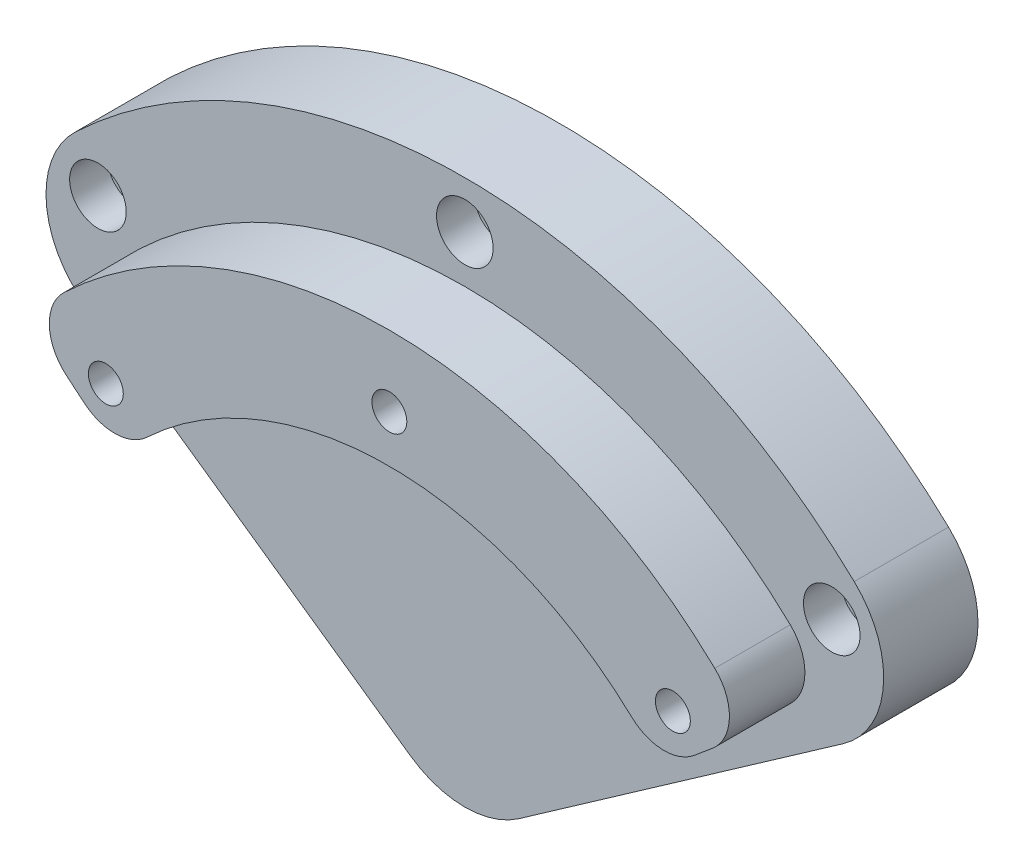
ISO-10303-21;
HEADER;
FILE_DESCRIPTION(('STEP AP214'),'2;1');
FILE_NAME('part.step','',(''),(''),'','','');
FILE_SCHEMA(('AUTOMOTIVE_DESIGN { 1 0 10303 214 1 1 1 1 }'));
ENDSEC;
DATA;
#1=APPLICATION_CONTEXT('core data for automotive mechanical design processes');
#2=APPLICATION_PROTOCOL_DEFINITION('international standard','automotive_design',2000,#1);
#3=PRODUCT_CONTEXT('',#1,'mechanical');
#4=PRODUCT('Part','Part','',(#3));
#5=PRODUCT_RELATED_PRODUCT_CATEGORY('part','',(#4));
#6=PRODUCT_DEFINITION_FORMATION('','',#4);
#7=PRODUCT_DEFINITION_CONTEXT('part definition',#1,'design');
#8=PRODUCT_DEFINITION('design','',#6,#7);
#9=PRODUCT_DEFINITION_SHAPE('','',#8);
#10=(LENGTH_UNIT() NAMED_UNIT(*) SI_UNIT(.MILLI.,.METRE.));
#11=(NAMED_UNIT(*) PLANE_ANGLE_UNIT() SI_UNIT($,.RADIAN.));
#12=(NAMED_UNIT(*) SI_UNIT($,.STERADIAN.) SOLID_ANGLE_UNIT());
#13=UNCERTAINTY_MEASURE_WITH_UNIT(LENGTH_MEASURE(1.E-05),#10,'distance_accuracy_value','');
#14=(GEOMETRIC_REPRESENTATION_CONTEXT(3) GLOBAL_UNCERTAINTY_ASSIGNED_CONTEXT((#13)) GLOBAL_UNIT_ASSIGNED_CONTEXT((#10,
#11,#12)) REPRESENTATION_CONTEXT('',''));
#15=CARTESIAN_POINT('',(0.,0.,0.));
#16=DIRECTION('',(0.,0.,1.));
#17=DIRECTION('',(1.,0.,0.));
#18=AXIS2_PLACEMENT_3D('',#15,#16,#17);
#19=CARTESIAN_POINT('',(38.8908729652601,38.8908729652601,0.));
#20=DIRECTION('',(0.,0.,1.));
#21=DIRECTION('',(1.,0.,0.));
#22=AXIS2_PLACEMENT_3D('',#19,#20,#21);
#23=CYLINDRICAL_SURFACE('',#22,1.60000000000001);
#24=CARTESIAN_POINT('',(38.8908729652601,38.8908729652601,0.));
#25=DIRECTION('',(0.,0.,1.));
#26=DIRECTION('',(1.,0.,0.));
#27=AXIS2_PLACEMENT_3D('',#24,#25,#26);
#28=CIRCLE('',#27,1.60000000000001);
#29=CARTESIAN_POINT('',(40.4908729652601,38.8908729652601,0.));
#30=VERTEX_POINT('',#29);
#31=EDGE_CURVE('E332',#30,#30,#28,.T.);
#32=ORIENTED_EDGE('',*,*,#31,.F.);
#33=EDGE_LOOP('',(#32));
#34=FACE_BOUND('',#33,.T.);
#35=CARTESIAN_POINT('',(38.8908729652601,38.8908729652601,6.));
#36=DIRECTION('',(0.,0.,1.));
#37=DIRECTION('',(1.,0.,0.));
#38=AXIS2_PLACEMENT_3D('',#35,#36,#37);
#39=CIRCLE('',#38,1.60000000000001);
#40=CARTESIAN_POINT('',(40.4908729652601,38.8908729652601,6.));
#41=VERTEX_POINT('',#40);
#42=EDGE_CURVE('E55',#41,#41,#39,.F.);
#43=ORIENTED_EDGE('',*,*,#42,.F.);
#44=EDGE_LOOP('',(#43));
#45=FACE_BOUND('',#44,.T.);
#46=ADVANCED_FACE('F51',(#34,#45),#23,.F.);
#47=CARTESIAN_POINT('',(0.,55.,0.));
#48=DIRECTION('',(0.,0.,1.));
#49=DIRECTION('',(1.,0.,0.));
#50=AXIS2_PLACEMENT_3D('',#47,#48,#49);
#51=CYLINDRICAL_SURFACE('',#50,1.6);
#52=CARTESIAN_POINT('',(0.,55.,0.));
#53=DIRECTION('',(0.,0.,1.));
#54=DIRECTION('',(1.,0.,0.));
#55=AXIS2_PLACEMENT_3D('',#52,#53,#54);
#56=CIRCLE('',#55,1.6);
#57=CARTESIAN_POINT('',(1.6,55.,0.));
#58=VERTEX_POINT('',#57);
#59=EDGE_CURVE('E191',#58,#58,#56,.T.);
#60=ORIENTED_EDGE('',*,*,#59,.F.);
#61=EDGE_LOOP('',(#60));
#62=FACE_BOUND('',#61,.T.);
#63=CARTESIAN_POINT('',(0.,55.,6.));
#64=DIRECTION('',(0.,0.,1.));
#65=DIRECTION('',(1.,0.,0.));
#66=AXIS2_PLACEMENT_3D('',#63,#64,#65);
#67=CIRCLE('',#66,1.6);
#68=CARTESIAN_POINT('',(1.6,55.,6.));
#69=VERTEX_POINT('',#68);
#70=EDGE_CURVE('E276',#69,#69,#67,.F.);
#71=ORIENTED_EDGE('',*,*,#70,.F.);
#72=EDGE_LOOP('',(#71));
#73=FACE_BOUND('',#72,.T.);
#74=ADVANCED_FACE('F387',(#62,#73),#51,.F.);
#75=CARTESIAN_POINT('',(-38.8908729652601,38.8908729652601,0.));
#76=DIRECTION('',(0.,0.,1.));
#77=DIRECTION('',(1.,0.,0.));
#78=AXIS2_PLACEMENT_3D('',#75,#76,#77);
#79=CYLINDRICAL_SURFACE('',#78,1.6);
#80=CARTESIAN_POINT('',(-38.8908729652601,38.8908729652601,0.));
#81=DIRECTION('',(0.,0.,1.));
#82=DIRECTION('',(1.,0.,0.));
#83=AXIS2_PLACEMENT_3D('',#80,#81,#82);
#84=CIRCLE('',#83,1.6);
#85=CARTESIAN_POINT('',(-37.2908729652601,38.8908729652601,0.));
#86=VERTEX_POINT('',#85);
#87=EDGE_CURVE('E184',#86,#86,#84,.T.);
#88=ORIENTED_EDGE('',*,*,#87,.F.);
#89=EDGE_LOOP('',(#88));
#90=FACE_BOUND('',#89,.T.);
#91=CARTESIAN_POINT('',(-38.8908729652601,38.8908729652601,6.));
#92=DIRECTION('',(0.,0.,1.));
#93=DIRECTION('',(1.,0.,0.));
#94=AXIS2_PLACEMENT_3D('',#91,#92,#93);
#95=CIRCLE('',#94,1.6);
#96=CARTESIAN_POINT('',(-37.2908729652601,38.8908729652601,6.));
#97=VERTEX_POINT('',#96);
#98=EDGE_CURVE('E273',#97,#97,#95,.F.);
#99=ORIENTED_EDGE('',*,*,#98,.F.);
#100=EDGE_LOOP('',(#99));
#101=FACE_BOUND('',#100,.T.);
#102=ADVANCED_FACE('F393',(#90,#101),#79,.F.);
#103=CARTESIAN_POINT('',(30.0520382004283,30.0520382004283,18.));
#104=DIRECTION('',(0.,0.,-1.));
#105=DIRECTION('',(-1.,0.,0.));
#106=AXIS2_PLACEMENT_3D('',#103,#104,#105);
#107=CYLINDRICAL_SURFACE('',#106,1.85);
#108=CARTESIAN_POINT('',(30.0520382004283,30.0520382004283,18.));
#109=DIRECTION('',(0.,0.,1.));
#110=DIRECTION('',(1.,0.,0.));
#111=AXIS2_PLACEMENT_3D('',#108,#109,#110);
#112=CIRCLE('',#111,1.85);
#113=CARTESIAN_POINT('',(31.9020382004283,30.0520382004283,18.));
#114=VERTEX_POINT('',#113);
#115=EDGE_CURVE('E324',#114,#114,#112,.T.);
#116=ORIENTED_EDGE('',*,*,#115,.T.);
#117=EDGE_LOOP('',(#116));
#118=FACE_BOUND('',#117,.T.);
#119=CARTESIAN_POINT('',(30.0520382004283,30.0520382004283,5.));
#120=DIRECTION('',(0.,0.,-1.));
#121=DIRECTION('',(-1.,0.,0.));
#122=AXIS2_PLACEMENT_3D('',#119,#120,#121);
#123=CIRCLE('',#122,1.85);
#124=CARTESIAN_POINT('',(28.2020382004283,30.0520382004283,5.));
#125=VERTEX_POINT('',#124);
#126=EDGE_CURVE('E767',#125,#125,#123,.F.);
#127=ORIENTED_EDGE('',*,*,#126,.F.);
#128=EDGE_LOOP('',(#127));
#129=FACE_BOUND('',#128,.T.);
#130=ADVANCED_FACE('F551',(#118,#129),#107,.F.);
#131=CARTESIAN_POINT('',(-30.0520382004283,30.0520382004283,18.));
#132=DIRECTION('',(0.,0.,-1.));
#133=DIRECTION('',(-1.,0.,0.));
#134=AXIS2_PLACEMENT_3D('',#131,#132,#133);
#135=CYLINDRICAL_SURFACE('',#134,1.85);
#136=CARTESIAN_POINT('',(-30.0520382004283,30.0520382004283,18.));
#137=DIRECTION('',(0.,0.,1.));
#138=DIRECTION('',(1.,0.,0.));
#139=AXIS2_PLACEMENT_3D('',#136,#137,#138);
#140=CIRCLE('',#139,1.85);
#141=CARTESIAN_POINT('',(-28.2020382004283,30.0520382004283,18.));
#142=VERTEX_POINT('',#141);
#143=EDGE_CURVE('E303',#142,#142,#140,.T.);
#144=ORIENTED_EDGE('',*,*,#143,.T.);
#145=EDGE_LOOP('',(#144));
#146=FACE_BOUND('',#145,.T.);
#147=CARTESIAN_POINT('',(-30.0520382004283,30.0520382004283,5.));
#148=DIRECTION('',(0.,0.,-1.));
#149=DIRECTION('',(-1.,0.,0.));
#150=AXIS2_PLACEMENT_3D('',#147,#148,#149);
#151=CIRCLE('',#150,1.85);
#152=CARTESIAN_POINT('',(-31.9020382004283,30.0520382004283,5.));
#153=VERTEX_POINT('',#152);
#154=EDGE_CURVE('E295',#153,#153,#151,.T.);
#155=ORIENTED_EDGE('',*,*,#154,.T.);
#156=EDGE_LOOP('',(#155));
#157=FACE_BOUND('',#156,.T.);
#158=ADVANCED_FACE('F556',(#146,#157),#135,.F.);
#159=CARTESIAN_POINT('',(0.,42.5,18.));
#160=DIRECTION('',(0.,0.,-1.));
#161=DIRECTION('',(-1.,0.,0.));
#162=AXIS2_PLACEMENT_3D('',#159,#160,#161);
#163=CYLINDRICAL_SURFACE('',#162,1.85);
#164=CARTESIAN_POINT('',(0.,42.5,18.));
#165=DIRECTION('',(0.,0.,1.));
#166=DIRECTION('',(1.,0.,0.));
#167=AXIS2_PLACEMENT_3D('',#164,#165,#166);
#168=CIRCLE('',#167,1.85);
#169=CARTESIAN_POINT('',(1.85,42.5,18.));
#170=VERTEX_POINT('',#169);
#171=EDGE_CURVE('E328',#170,#170,#168,.T.);
#172=ORIENTED_EDGE('',*,*,#171,.T.);
#173=EDGE_LOOP('',(#172));
#174=FACE_BOUND('',#173,.T.);
#175=CARTESIAN_POINT('',(0.,42.5,5.));
#176=DIRECTION('',(0.,0.,-1.));
#177=DIRECTION('',(-1.,0.,0.));
#178=AXIS2_PLACEMENT_3D('',#175,#176,#177);
#179=CIRCLE('',#178,1.85);
#180=CARTESIAN_POINT('',(-1.85,42.5,5.));
#181=VERTEX_POINT('',#180);
#182=EDGE_CURVE('E782',#181,#181,#179,.F.);
#183=ORIENTED_EDGE('',*,*,#182,.F.);
#184=EDGE_LOOP('',(#183));
#185=FACE_BOUND('',#184,.T.);
#186=ADVANCED_FACE('F405',(#174,#185),#163,.F.);
#187=CARTESIAN_POINT('',(0.,0.,0.));
#188=DIRECTION('',(0.,0.,1.));
#189=DIRECTION('',(1.,0.,0.));
#190=AXIS2_PLACEMENT_3D('',#187,#188,#189);
#191=PLANE('',#190);
#192=CARTESIAN_POINT('',(30.0520382004283,30.0520382004283,0.));
#193=DIRECTION('',(0.,0.,-1.));
#194=DIRECTION('',(-1.,0.,0.));
#195=AXIS2_PLACEMENT_3D('',#192,#193,#194);
#196=CIRCLE('',#195,3.25);
#197=CARTESIAN_POINT('',(26.8020382004283,30.0520382004283,0.));
#198=VERTEX_POINT('',#197);
#199=EDGE_CURVE('E771',#198,#198,#196,.T.);
#200=ORIENTED_EDGE('',*,*,#199,.F.);
#201=EDGE_LOOP('',(#200));
#202=FACE_BOUND('',#201,.T.);
#203=CARTESIAN_POINT('',(0.,42.5,0.));
#204=DIRECTION('',(0.,0.,-1.));
#205=DIRECTION('',(-1.,0.,0.));
#206=AXIS2_PLACEMENT_3D('',#203,#204,#205);
#207=CIRCLE('',#206,3.25);
#208=CARTESIAN_POINT('',(-3.25,42.5,0.));
#209=VERTEX_POINT('',#208);
#210=EDGE_CURVE('E778',#209,#209,#207,.T.);
#211=ORIENTED_EDGE('',*,*,#210,.F.);
#212=EDGE_LOOP('',(#211));
#213=FACE_BOUND('',#212,.T.);
#214=CARTESIAN_POINT('',(-30.0520382004283,30.0520382004283,0.));
#215=DIRECTION('',(0.,0.,-1.));
#216=DIRECTION('',(-1.,0.,0.));
#217=AXIS2_PLACEMENT_3D('',#214,#215,#216);
#218=CIRCLE('',#217,3.25);
#219=CARTESIAN_POINT('',(-33.3020382004283,30.0520382004283,0.));
#220=VERTEX_POINT('',#219);
#221=EDGE_CURVE('E289',#220,#220,#218,.T.);
#222=ORIENTED_EDGE('',*,*,#221,.F.);
#223=EDGE_LOOP('',(#222));
#224=FACE_BOUND('',#223,.T.);
#225=ORIENTED_EDGE('',*,*,#87,.T.);
#226=EDGE_LOOP('',(#225));
#227=FACE_BOUND('',#226,.T.);
#228=ORIENTED_EDGE('',*,*,#59,.T.);
#229=EDGE_LOOP('',(#228));
#230=FACE_BOUND('',#229,.T.);
#231=ORIENTED_EDGE('',*,*,#31,.T.);
#232=EDGE_LOOP('',(#231));
#233=FACE_BOUND('',#232,.T.);
#234=CARTESIAN_POINT('',(0.,0.,0.));
#235=DIRECTION('',(0.,0.,1.));
#236=DIRECTION('',(1.,0.,0.));
#237=AXIS2_PLACEMENT_3D('',#234,#235,#236);
#238=CIRCLE('',#237,60.);
#239=CARTESIAN_POINT('',(41.2731914901654,43.5490948725245,0.));
#240=VERTEX_POINT('',#239);
#241=CARTESIAN_POINT('',(-41.2731914901654,43.5490948725245,0.));
#242=VERTEX_POINT('',#241);
#243=EDGE_CURVE('E172',#240,#242,#238,.T.);
#244=ORIENTED_EDGE('',*,*,#243,.F.);
#245=CARTESIAN_POINT('',(34.3943262418045,36.2909123937704,0.));
#246=DIRECTION('',(0.,0.,1.));
#247=DIRECTION('',(1.,0.,0.));
#248=AXIS2_PLACEMENT_3D('',#245,#246,#247);
#249=CIRCLE('',#248,10.);
#250=CARTESIAN_POINT('',(40.130090605315,28.0993919508805,0.));
#251=VERTEX_POINT('',#250);
#252=EDGE_CURVE('E154',#240,#251,#249,.F.);
#253=ORIENTED_EDGE('',*,*,#252,.T.);
#254=DIRECTION('',(0.819152044288989,0.57357643635105,0.));
#255=VECTOR('',#254,1.);
#256=CARTESIAN_POINT('',(0.,0.,0.));
#257=LINE('',#256,#255);
#258=CARTESIAN_POINT('',(5.7357643635105,4.01622544472471,0.));
#259=VERTEX_POINT('',#258);
#260=EDGE_CURVE('E188',#259,#251,#257,.T.);
#261=ORIENTED_EDGE('',*,*,#260,.F.);
#262=CARTESIAN_POINT('',(0.,12.2077458876146,0.));
#263=DIRECTION('',(0.,0.,1.));
#264=DIRECTION('',(1.,0.,0.));
#265=AXIS2_PLACEMENT_3D('',#262,#263,#264);
#266=CIRCLE('',#265,10.);
#267=CARTESIAN_POINT('',(-5.7357643635105,4.01622544472471,0.));
#268=VERTEX_POINT('',#267);
#269=EDGE_CURVE('E177',#259,#268,#266,.F.);
#270=ORIENTED_EDGE('',*,*,#269,.T.);
#271=DIRECTION('',(-0.819152044288989,0.57357643635105,0.));
#272=VECTOR('',#271,1.);
#273=CARTESIAN_POINT('',(0.,0.,0.));
#274=LINE('',#273,#272);
#275=CARTESIAN_POINT('',(-40.130090605315,28.0993919508805,0.));
#276=VERTEX_POINT('',#275);
#277=EDGE_CURVE('E183',#268,#276,#274,.T.);
#278=ORIENTED_EDGE('',*,*,#277,.T.);
#279=CARTESIAN_POINT('',(-34.3943262418045,36.2909123937704,0.));
#280=DIRECTION('',(0.,0.,1.));
#281=DIRECTION('',(1.,0.,0.));
#282=AXIS2_PLACEMENT_3D('',#279,#280,#281);
#283=CIRCLE('',#282,10.);
#284=EDGE_CURVE('E166',#276,#242,#283,.F.);
#285=ORIENTED_EDGE('',*,*,#284,.T.);
#286=EDGE_LOOP('',(#244,#253,#261,#270,#278,#285));
#287=FACE_BOUND('',#286,.T.);
#288=ADVANCED_FACE('F180',(#202,#213,#224,#227,#230,#233,#287),#191,.F.);
#289=CARTESIAN_POINT('',(0.,0.,10.));
#290=DIRECTION('',(0.,0.,-1.));
#291=DIRECTION('',(-1.,0.,0.));
#292=AXIS2_PLACEMENT_3D('',#289,#290,#291);
#293=CYLINDRICAL_SURFACE('',#292,60.);
#294=CARTESIAN_POINT('',(0.,0.,10.));
#295=DIRECTION('',(0.,0.,1.));
#296=DIRECTION('',(1.,0.,0.));
#297=AXIS2_PLACEMENT_3D('',#294,#295,#296);
#298=CIRCLE('',#297,60.);
#299=CARTESIAN_POINT('',(41.2731914901654,43.5490948725245,10.));
#300=VERTEX_POINT('',#299);
#301=CARTESIAN_POINT('',(-41.2731914901654,43.5490948725245,10.));
#302=VERTEX_POINT('',#301);
#303=EDGE_CURVE('E175',#300,#302,#298,.T.);
#304=ORIENTED_EDGE('',*,*,#303,.F.);
#305=DIRECTION('',(0.,0.,-1.));
#306=VECTOR('',#305,1.);
#307=CARTESIAN_POINT('',(41.2731914901654,43.5490948725245,10.));
#308=LINE('',#307,#306);
#309=EDGE_CURVE('E158',#300,#240,#308,.T.);
#310=ORIENTED_EDGE('',*,*,#309,.T.);
#311=ORIENTED_EDGE('',*,*,#243,.T.);
#312=DIRECTION('',(0.,0.,-1.));
#313=VECTOR('',#312,1.);
#314=CARTESIAN_POINT('',(-41.2731914901654,43.5490948725245,10.));
#315=LINE('',#314,#313);
#316=EDGE_CURVE('E178',#242,#302,#315,.F.);
#317=ORIENTED_EDGE('',*,*,#316,.T.);
#318=EDGE_LOOP('',(#304,#310,#311,#317));
#319=FACE_BOUND('',#318,.T.);
#320=ADVANCED_FACE('F171',(#319),#293,.T.);
#321=CARTESIAN_POINT('',(0.,0.,10.));
#322=DIRECTION('',(-0.57357643635105,-0.819152044288989,0.));
#323=DIRECTION('',(0.819152044288989,-0.57357643635105,0.));
#324=AXIS2_PLACEMENT_3D('',#321,#322,#323);
#325=PLANE('',#324);
#326=DIRECTION('',(-0.819152044288989,0.57357643635105,0.));
#327=VECTOR('',#326,1.);
#328=CARTESIAN_POINT('',(0.,0.,10.));
#329=LINE('',#328,#327);
#330=CARTESIAN_POINT('',(-5.7357643635105,4.01622544472471,10.));
#331=VERTEX_POINT('',#330);
#332=CARTESIAN_POINT('',(-40.130090605315,28.0993919508805,10.));
#333=VERTEX_POINT('',#332);
#334=EDGE_CURVE('E354',#331,#333,#329,.T.);
#335=ORIENTED_EDGE('',*,*,#334,.T.);
#336=DIRECTION('',(0.,0.,1.));
#337=VECTOR('',#336,1.);
#338=CARTESIAN_POINT('',(-40.130090605315,28.0993919508805,0.));
#339=LINE('',#338,#337);
#340=EDGE_CURVE('E222',#333,#276,#339,.F.);
#341=ORIENTED_EDGE('',*,*,#340,.T.);
#342=ORIENTED_EDGE('',*,*,#277,.F.);
#343=DIRECTION('',(0.,0.,-1.));
#344=VECTOR('',#343,1.);
#345=CARTESIAN_POINT('',(-5.7357643635105,4.01622544472471,10.));
#346=LINE('',#345,#344);
#347=EDGE_CURVE('E219',#268,#331,#346,.F.);
#348=ORIENTED_EDGE('',*,*,#347,.T.);
#349=EDGE_LOOP('',(#335,#341,#342,#348));
#350=FACE_BOUND('',#349,.T.);
#351=ADVANCED_FACE('F373',(#350),#325,.T.);
#352=CARTESIAN_POINT('',(0.,0.,10.));
#353=DIRECTION('',(-0.57357643635105,0.819152044288989,0.));
#354=DIRECTION('',(-0.819152044288989,-0.57357643635105,0.));
#355=AXIS2_PLACEMENT_3D('',#352,#353,#354);
#356=PLANE('',#355);
#357=ORIENTED_EDGE('',*,*,#260,.T.);
#358=DIRECTION('',(0.,0.,-1.));
#359=VECTOR('',#358,1.);
#360=CARTESIAN_POINT('',(40.130090605315,28.0993919508805,10.));
#361=LINE('',#360,#359);
#362=CARTESIAN_POINT('',(40.130090605315,28.0993919508805,10.));
#363=VERTEX_POINT('',#362);
#364=EDGE_CURVE('E159',#251,#363,#361,.F.);
#365=ORIENTED_EDGE('',*,*,#364,.T.);
#366=DIRECTION('',(0.819152044288989,0.57357643635105,0.));
#367=VECTOR('',#366,1.);
#368=CARTESIAN_POINT('',(0.,0.,10.));
#369=LINE('',#368,#367);
#370=CARTESIAN_POINT('',(5.7357643635105,4.01622544472471,10.));
#371=VERTEX_POINT('',#370);
#372=EDGE_CURVE('E194',#371,#363,#369,.T.);
#373=ORIENTED_EDGE('',*,*,#372,.F.);
#374=DIRECTION('',(0.,0.,-1.));
#375=VECTOR('',#374,1.);
#376=CARTESIAN_POINT('',(5.7357643635105,4.01622544472471,0.));
#377=LINE('',#376,#375);
#378=EDGE_CURVE('E165',#371,#259,#377,.T.);
#379=ORIENTED_EDGE('',*,*,#378,.T.);
#380=EDGE_LOOP('',(#357,#365,#373,#379));
#381=FACE_BOUND('',#380,.T.);
#382=ADVANCED_FACE('F368',(#381),#356,.F.);
#383=CARTESIAN_POINT('',(0.,0.,10.));
#384=DIRECTION('',(0.,0.,1.));
#385=DIRECTION('',(1.,0.,0.));
#386=AXIS2_PLACEMENT_3D('',#383,#384,#385);
#387=PLANE('',#386);
#388=CARTESIAN_POINT('',(-38.8908729652601,38.8908729652601,10.));
#389=DIRECTION('',(0.,0.,1.));
#390=DIRECTION('',(1.,0.,0.));
#391=AXIS2_PLACEMENT_3D('',#388,#389,#390);
#392=CIRCLE('',#391,3.);
#393=CARTESIAN_POINT('',(-35.8908729652601,38.8908729652601,10.));
#394=VERTEX_POINT('',#393);
#395=EDGE_CURVE('E815',#394,#394,#392,.T.);
#396=ORIENTED_EDGE('',*,*,#395,.F.);
#397=EDGE_LOOP('',(#396));
#398=FACE_BOUND('',#397,.T.);
#399=CARTESIAN_POINT('',(0.,55.,10.));
#400=DIRECTION('',(0.,0.,1.));
#401=DIRECTION('',(1.,0.,0.));
#402=AXIS2_PLACEMENT_3D('',#399,#400,#401);
#403=CIRCLE('',#402,3.);
#404=CARTESIAN_POINT('',(3.,55.,10.));
#405=VERTEX_POINT('',#404);
#406=EDGE_CURVE('E762',#405,#405,#403,.T.);
#407=ORIENTED_EDGE('',*,*,#406,.F.);
#408=EDGE_LOOP('',(#407));
#409=FACE_BOUND('',#408,.T.);
#410=CARTESIAN_POINT('',(38.8908729652601,38.8908729652601,10.));
#411=DIRECTION('',(0.,0.,1.));
#412=DIRECTION('',(1.,0.,0.));
#413=AXIS2_PLACEMENT_3D('',#410,#411,#412);
#414=CIRCLE('',#413,3.);
#415=CARTESIAN_POINT('',(41.8908729652601,38.8908729652601,10.));
#416=VERTEX_POINT('',#415);
#417=EDGE_CURVE('E754',#416,#416,#414,.T.);
#418=ORIENTED_EDGE('',*,*,#417,.F.);
#419=EDGE_LOOP('',(#418));
#420=FACE_BOUND('',#419,.T.);
#421=CARTESIAN_POINT('',(0.,0.,10.));
#422=DIRECTION('',(0.,0.,1.));
#423=DIRECTION('',(1.,0.,0.));
#424=AXIS2_PLACEMENT_3D('',#421,#422,#423);
#425=CIRCLE('',#424,37.5);
#426=CARTESIAN_POINT('',(25.691345773208,27.3167485686248,10.));
#427=VERTEX_POINT('',#426);
#428=CARTESIAN_POINT('',(-25.691345773208,27.3167485686248,10.));
#429=VERTEX_POINT('',#428);
#430=EDGE_CURVE('E341',#427,#429,#425,.T.);
#431=ORIENTED_EDGE('',*,*,#430,.T.);
#432=CARTESIAN_POINT('',(-29.1168585429691,30.9589817111081,10.));
#433=DIRECTION('',(0.,0.,1.));
#434=DIRECTION('',(1.,0.,0.));
#435=AXIS2_PLACEMENT_3D('',#432,#433,#434);
#436=CIRCLE('',#435,5.);
#437=CARTESIAN_POINT('',(-32.3307965914018,27.1287594955132,10.));
#438=VERTEX_POINT('',#437);
#439=EDGE_CURVE('E12',#429,#438,#436,.F.);
#440=ORIENTED_EDGE('',*,*,#439,.T.);
#441=DIRECTION('',(-0.766044443118975,0.642787609686543,0.));
#442=VECTOR('',#441,1.);
#443=CARTESIAN_POINT('',(0.,0.,10.));
#444=LINE('',#443,#442);
#445=CARTESIAN_POINT('',(-34.258548972,28.7463358070743,10.));
#446=VERTEX_POINT('',#445);
#447=EDGE_CURVE('E337',#438,#446,#444,.T.);
#448=ORIENTED_EDGE('',*,*,#447,.T.);
#449=CARTESIAN_POINT('',(-31.0446109235673,32.5765580226691,10.));
#450=DIRECTION('',(0.,0.,1.));
#451=DIRECTION('',(1.,0.,0.));
#452=AXIS2_PLACEMENT_3D('',#449,#450,#451);
#453=CIRCLE('',#452,5.);
#454=CARTESIAN_POINT('',(-34.4940121372969,36.1961755807435,10.));
#455=VERTEX_POINT('',#454);
#456=EDGE_CURVE('E61',#446,#455,#453,.F.);
#457=ORIENTED_EDGE('',*,*,#456,.T.);
#458=CARTESIAN_POINT('',(0.,0.,10.));
#459=DIRECTION('',(0.,0.,1.));
#460=DIRECTION('',(1.,0.,0.));
#461=AXIS2_PLACEMENT_3D('',#458,#459,#460);
#462=CIRCLE('',#461,50.);
#463=CARTESIAN_POINT('',(34.4940121372969,36.1961755807435,10.));
#464=VERTEX_POINT('',#463);
#465=EDGE_CURVE('E333',#464,#455,#462,.T.);
#466=ORIENTED_EDGE('',*,*,#465,.F.);
#467=CARTESIAN_POINT('',(31.0446109235672,32.5765580226692,10.));
#468=DIRECTION('',(0.,0.,1.));
#469=DIRECTION('',(1.,0.,0.));
#470=AXIS2_PLACEMENT_3D('',#467,#468,#469);
#471=CIRCLE('',#470,5.);
#472=CARTESIAN_POINT('',(34.258548972,28.7463358070743,10.));
#473=VERTEX_POINT('',#472);
#474=EDGE_CURVE('E268',#464,#473,#471,.F.);
#475=ORIENTED_EDGE('',*,*,#474,.T.);
#476=DIRECTION('',(0.766044443118974,0.642787609686544,0.));
#477=VECTOR('',#476,1.);
#478=CARTESIAN_POINT('',(0.,0.,10.));
#479=LINE('',#478,#477);
#480=CARTESIAN_POINT('',(32.3307965914018,27.1287594955132,10.));
#481=VERTEX_POINT('',#480);
#482=EDGE_CURVE('E308',#481,#473,#479,.T.);
#483=ORIENTED_EDGE('',*,*,#482,.F.);
#484=CARTESIAN_POINT('',(29.1168585429691,30.9589817111081,10.));
#485=DIRECTION('',(0.,0.,1.));
#486=DIRECTION('',(1.,0.,0.));
#487=AXIS2_PLACEMENT_3D('',#484,#485,#486);
#488=CIRCLE('',#487,5.);
#489=EDGE_CURVE('E265',#481,#427,#488,.F.);
#490=ORIENTED_EDGE('',*,*,#489,.T.);
#491=EDGE_LOOP('',(#431,#440,#448,#457,#466,#475,#483,#490));
#492=FACE_BOUND('',#491,.T.);
#493=ORIENTED_EDGE('',*,*,#372,.T.);
#494=CARTESIAN_POINT('',(34.3943262418045,36.2909123937704,10.));
#495=DIRECTION('',(0.,0.,1.));
#496=DIRECTION('',(1.,0.,0.));
#497=AXIS2_PLACEMENT_3D('',#494,#495,#496);
#498=CIRCLE('',#497,10.);
#499=EDGE_CURVE('E216',#363,#300,#498,.T.);
#500=ORIENTED_EDGE('',*,*,#499,.T.);
#501=ORIENTED_EDGE('',*,*,#303,.T.);
#502=CARTESIAN_POINT('',(-34.3943262418045,36.2909123937704,10.));
#503=DIRECTION('',(0.,0.,1.));
#504=DIRECTION('',(1.,0.,0.));
#505=AXIS2_PLACEMENT_3D('',#502,#503,#504);
#506=CIRCLE('',#505,10.);
#507=EDGE_CURVE('E213',#302,#333,#506,.T.);
#508=ORIENTED_EDGE('',*,*,#507,.T.);
#509=ORIENTED_EDGE('',*,*,#334,.F.);
#510=CARTESIAN_POINT('',(0.,12.2077458876146,10.));
#511=DIRECTION('',(0.,0.,1.));
#512=DIRECTION('',(1.,0.,0.));
#513=AXIS2_PLACEMENT_3D('',#510,#511,#512);
#514=CIRCLE('',#513,10.);
#515=EDGE_CURVE('E210',#331,#371,#514,.T.);
#516=ORIENTED_EDGE('',*,*,#515,.T.);
#517=EDGE_LOOP('',(#493,#500,#501,#508,#509,#516));
#518=FACE_BOUND('',#517,.T.);
#519=ADVANCED_FACE('F364',(#398,#409,#420,#492,#518),#387,.T.);
#520=CARTESIAN_POINT('',(34.3943262418045,36.2909123937704,10.));
#521=DIRECTION('',(0.,0.,-1.));
#522=DIRECTION('',(-1.,0.,0.));
#523=AXIS2_PLACEMENT_3D('',#520,#521,#522);
#524=CYLINDRICAL_SURFACE('',#523,10.);
#525=ORIENTED_EDGE('',*,*,#499,.F.);
#526=ORIENTED_EDGE('',*,*,#364,.F.);
#527=ORIENTED_EDGE('',*,*,#252,.F.);
#528=ORIENTED_EDGE('',*,*,#309,.F.);
#529=EDGE_LOOP('',(#525,#526,#527,#528));
#530=FACE_BOUND('',#529,.T.);
#531=ADVANCED_FACE('F157',(#530),#524,.T.);
#532=CARTESIAN_POINT('',(-34.3943262418045,36.2909123937704,10.));
#533=DIRECTION('',(0.,0.,-1.));
#534=DIRECTION('',(-1.,0.,0.));
#535=AXIS2_PLACEMENT_3D('',#532,#533,#534);
#536=CYLINDRICAL_SURFACE('',#535,10.);
#537=ORIENTED_EDGE('',*,*,#507,.F.);
#538=ORIENTED_EDGE('',*,*,#316,.F.);
#539=ORIENTED_EDGE('',*,*,#284,.F.);
#540=ORIENTED_EDGE('',*,*,#340,.F.);
#541=EDGE_LOOP('',(#537,#538,#539,#540));
#542=FACE_BOUND('',#541,.T.);
#543=ADVANCED_FACE('F376',(#542),#536,.T.);
#544=CARTESIAN_POINT('',(0.,12.2077458876146,10.));
#545=DIRECTION('',(0.,0.,1.));
#546=DIRECTION('',(1.,0.,0.));
#547=AXIS2_PLACEMENT_3D('',#544,#545,#546);
#548=CYLINDRICAL_SURFACE('',#547,10.);
#549=ORIENTED_EDGE('',*,*,#515,.F.);
#550=ORIENTED_EDGE('',*,*,#347,.F.);
#551=ORIENTED_EDGE('',*,*,#269,.F.);
#552=ORIENTED_EDGE('',*,*,#378,.F.);
#553=EDGE_LOOP('',(#549,#550,#551,#552));
#554=FACE_BOUND('',#553,.T.);
#555=ADVANCED_FACE('F370',(#554),#548,.T.);
#556=CARTESIAN_POINT('',(0.,0.,18.));
#557=DIRECTION('',(0.,0.,-1.));
#558=DIRECTION('',(-1.,0.,0.));
#559=AXIS2_PLACEMENT_3D('',#556,#557,#558);
#560=CYLINDRICAL_SURFACE('',#559,50.);
#561=CARTESIAN_POINT('',(0.,0.,18.));
#562=DIRECTION('',(0.,0.,1.));
#563=DIRECTION('',(1.,0.,0.));
#564=AXIS2_PLACEMENT_3D('',#561,#562,#563);
#565=CIRCLE('',#564,50.);
#566=CARTESIAN_POINT('',(34.4940121372969,36.1961755807435,18.));
#567=VERTEX_POINT('',#566);
#568=CARTESIAN_POINT('',(-34.4940121372969,36.1961755807435,18.));
#569=VERTEX_POINT('',#568);
#570=EDGE_CURVE('E307',#567,#569,#565,.T.);
#571=ORIENTED_EDGE('',*,*,#570,.F.);
#572=DIRECTION('',(0.,0.,-1.));
#573=VECTOR('',#572,1.);
#574=CARTESIAN_POINT('',(34.4940121372969,36.1961755807435,18.));
#575=LINE('',#574,#573);
#576=EDGE_CURVE('E255',#567,#464,#575,.T.);
#577=ORIENTED_EDGE('',*,*,#576,.T.);
#578=ORIENTED_EDGE('',*,*,#465,.T.);
#579=DIRECTION('',(0.,0.,-1.));
#580=VECTOR('',#579,1.);
#581=CARTESIAN_POINT('',(-34.4940121372969,36.1961755807435,18.));
#582=LINE('',#581,#580);
#583=EDGE_CURVE('E252',#455,#569,#582,.F.);
#584=ORIENTED_EDGE('',*,*,#583,.T.);
#585=EDGE_LOOP('',(#571,#577,#578,#584));
#586=FACE_BOUND('',#585,.T.);
#587=ADVANCED_FACE('F383',(#586),#560,.T.);
#588=CARTESIAN_POINT('',(0.,0.,18.));
#589=DIRECTION('',(-0.642787609686543,-0.766044443118975,0.));
#590=DIRECTION('',(0.766044443118975,-0.642787609686543,0.));
#591=AXIS2_PLACEMENT_3D('',#588,#589,#590);
#592=PLANE('',#591);
#593=DIRECTION('',(-0.766044443118975,0.642787609686543,0.));
#594=VECTOR('',#593,1.);
#595=CARTESIAN_POINT('',(0.,0.,18.));
#596=LINE('',#595,#594);
#597=CARTESIAN_POINT('',(-32.3307965914018,27.1287594955132,18.));
#598=VERTEX_POINT('',#597);
#599=CARTESIAN_POINT('',(-34.258548972,28.7463358070743,18.));
#600=VERTEX_POINT('',#599);
#601=EDGE_CURVE('E312',#598,#600,#596,.T.);
#602=ORIENTED_EDGE('',*,*,#601,.T.);
#603=DIRECTION('',(0.,0.,1.));
#604=VECTOR('',#603,1.);
#605=CARTESIAN_POINT('',(-34.258548972,28.7463358070743,10.));
#606=LINE('',#605,#604);
#607=EDGE_CURVE('E262',#600,#446,#606,.F.);
#608=ORIENTED_EDGE('',*,*,#607,.T.);
#609=ORIENTED_EDGE('',*,*,#447,.F.);
#610=DIRECTION('',(0.,0.,-1.));
#611=VECTOR('',#610,1.);
#612=CARTESIAN_POINT('',(-32.3307965914018,27.1287594955132,18.));
#613=LINE('',#612,#611);
#614=EDGE_CURVE('E259',#438,#598,#613,.F.);
#615=ORIENTED_EDGE('',*,*,#614,.T.);
#616=EDGE_LOOP('',(#602,#608,#609,#615));
#617=FACE_BOUND('',#616,.T.);
#618=ADVANCED_FACE('F457',(#617),#592,.T.);
#619=CARTESIAN_POINT('',(0.,0.,18.));
#620=DIRECTION('',(0.,0.,-1.));
#621=DIRECTION('',(-1.,0.,0.));
#622=AXIS2_PLACEMENT_3D('',#619,#620,#621);
#623=CYLINDRICAL_SURFACE('',#622,37.5);
#624=ORIENTED_EDGE('',*,*,#430,.F.);
#625=DIRECTION('',(0.,0.,-1.));
#626=VECTOR('',#625,1.);
#627=CARTESIAN_POINT('',(25.691345773208,27.3167485686248,18.));
#628=LINE('',#627,#626);
#629=CARTESIAN_POINT('',(25.691345773208,27.3167485686248,18.));
#630=VERTEX_POINT('',#629);
#631=EDGE_CURVE('E237',#427,#630,#628,.F.);
#632=ORIENTED_EDGE('',*,*,#631,.T.);
#633=CARTESIAN_POINT('',(0.,0.,18.));
#634=DIRECTION('',(0.,0.,1.));
#635=DIRECTION('',(1.,0.,0.));
#636=AXIS2_PLACEMENT_3D('',#633,#634,#635);
#637=CIRCLE('',#636,37.5);
#638=CARTESIAN_POINT('',(-25.691345773208,27.3167485686248,18.));
#639=VERTEX_POINT('',#638);
#640=EDGE_CURVE('E316',#630,#639,#637,.T.);
#641=ORIENTED_EDGE('',*,*,#640,.T.);
#642=DIRECTION('',(0.,0.,-1.));
#643=VECTOR('',#642,1.);
#644=CARTESIAN_POINT('',(-25.6913457732081,27.3167485686248,18.));
#645=LINE('',#644,#643);
#646=EDGE_CURVE('E233',#639,#429,#645,.T.);
#647=ORIENTED_EDGE('',*,*,#646,.T.);
#648=EDGE_LOOP('',(#624,#632,#641,#647));
#649=FACE_BOUND('',#648,.T.);
#650=ADVANCED_FACE('F468',(#649),#623,.F.);
#651=CARTESIAN_POINT('',(0.,0.,18.));
#652=DIRECTION('',(-0.642787609686544,0.766044443118974,0.));
#653=DIRECTION('',(-0.766044443118974,-0.642787609686544,0.));
#654=AXIS2_PLACEMENT_3D('',#651,#652,#653);
#655=PLANE('',#654);
#656=DIRECTION('',(0.766044443118974,0.642787609686544,0.));
#657=VECTOR('',#656,1.);
#658=CARTESIAN_POINT('',(0.,0.,18.));
#659=LINE('',#658,#657);
#660=CARTESIAN_POINT('',(32.3307965914018,27.1287594955132,18.));
#661=VERTEX_POINT('',#660);
#662=CARTESIAN_POINT('',(34.258548972,28.7463358070743,18.));
#663=VERTEX_POINT('',#662);
#664=EDGE_CURVE('E320',#661,#663,#659,.T.);
#665=ORIENTED_EDGE('',*,*,#664,.F.);
#666=DIRECTION('',(0.,0.,1.));
#667=VECTOR('',#666,1.);
#668=CARTESIAN_POINT('',(32.3307965914018,27.1287594955132,10.));
#669=LINE('',#668,#667);
#670=EDGE_CURVE('E229',#661,#481,#669,.F.);
#671=ORIENTED_EDGE('',*,*,#670,.T.);
#672=ORIENTED_EDGE('',*,*,#482,.T.);
#673=DIRECTION('',(0.,0.,-1.));
#674=VECTOR('',#673,1.);
#675=CARTESIAN_POINT('',(34.258548972,28.7463358070743,18.));
#676=LINE('',#675,#674);
#677=EDGE_CURVE('E226',#473,#663,#676,.F.);
#678=ORIENTED_EDGE('',*,*,#677,.T.);
#679=EDGE_LOOP('',(#665,#671,#672,#678));
#680=FACE_BOUND('',#679,.T.);
#681=ADVANCED_FACE('F479',(#680),#655,.F.);
#682=CARTESIAN_POINT('',(0.,0.,18.));
#683=DIRECTION('',(0.,0.,1.));
#684=DIRECTION('',(1.,0.,0.));
#685=AXIS2_PLACEMENT_3D('',#682,#683,#684);
#686=PLANE('',#685);
#687=ORIENTED_EDGE('',*,*,#143,.F.);
#688=EDGE_LOOP('',(#687));
#689=FACE_BOUND('',#688,.T.);
#690=ORIENTED_EDGE('',*,*,#640,.F.);
#691=CARTESIAN_POINT('',(29.1168585429691,30.9589817111081,18.));
#692=DIRECTION('',(0.,0.,1.));
#693=DIRECTION('',(1.,0.,0.));
#694=AXIS2_PLACEMENT_3D('',#691,#692,#693);
#695=CIRCLE('',#694,5.);
#696=EDGE_CURVE('E249',#630,#661,#695,.T.);
#697=ORIENTED_EDGE('',*,*,#696,.T.);
#698=ORIENTED_EDGE('',*,*,#664,.T.);
#699=CARTESIAN_POINT('',(31.0446109235672,32.5765580226692,18.));
#700=DIRECTION('',(0.,0.,1.));
#701=DIRECTION('',(1.,0.,0.));
#702=AXIS2_PLACEMENT_3D('',#699,#700,#701);
#703=CIRCLE('',#702,5.);
#704=EDGE_CURVE('E246',#663,#567,#703,.T.);
#705=ORIENTED_EDGE('',*,*,#704,.T.);
#706=ORIENTED_EDGE('',*,*,#570,.T.);
#707=CARTESIAN_POINT('',(-31.0446109235673,32.5765580226691,18.));
#708=DIRECTION('',(0.,0.,1.));
#709=DIRECTION('',(1.,0.,0.));
#710=AXIS2_PLACEMENT_3D('',#707,#708,#709);
#711=CIRCLE('',#710,5.);
#712=EDGE_CURVE('E243',#569,#600,#711,.T.);
#713=ORIENTED_EDGE('',*,*,#712,.T.);
#714=ORIENTED_EDGE('',*,*,#601,.F.);
#715=CARTESIAN_POINT('',(-29.1168585429691,30.9589817111081,18.));
#716=DIRECTION('',(0.,0.,1.));
#717=DIRECTION('',(1.,0.,0.));
#718=AXIS2_PLACEMENT_3D('',#715,#716,#717);
#719=CIRCLE('',#718,5.);
#720=EDGE_CURVE('E240',#598,#639,#719,.T.);
#721=ORIENTED_EDGE('',*,*,#720,.T.);
#722=EDGE_LOOP('',(#690,#697,#698,#705,#706,#713,#714,#721));
#723=FACE_BOUND('',#722,.T.);
#724=ORIENTED_EDGE('',*,*,#115,.F.);
#725=EDGE_LOOP('',(#724));
#726=FACE_BOUND('',#725,.T.);
#727=ORIENTED_EDGE('',*,*,#171,.F.);
#728=EDGE_LOOP('',(#727));
#729=FACE_BOUND('',#728,.T.);
#730=ADVANCED_FACE('F490',(#689,#723,#726,#729),#686,.T.);
#731=CARTESIAN_POINT('',(29.1168585429691,30.9589817111081,18.));
#732=DIRECTION('',(0.,0.,-1.));
#733=DIRECTION('',(-1.,0.,0.));
#734=AXIS2_PLACEMENT_3D('',#731,#732,#733);
#735=CYLINDRICAL_SURFACE('',#734,5.);
#736=ORIENTED_EDGE('',*,*,#696,.F.);
#737=ORIENTED_EDGE('',*,*,#631,.F.);
#738=ORIENTED_EDGE('',*,*,#489,.F.);
#739=ORIENTED_EDGE('',*,*,#670,.F.);
#740=EDGE_LOOP('',(#736,#737,#738,#739));
#741=FACE_BOUND('',#740,.T.);
#742=ADVANCED_FACE('F502',(#741),#735,.T.);
#743=CARTESIAN_POINT('',(31.0446109235672,32.5765580226692,18.));
#744=DIRECTION('',(0.,0.,-1.));
#745=DIRECTION('',(-1.,0.,0.));
#746=AXIS2_PLACEMENT_3D('',#743,#744,#745);
#747=CYLINDRICAL_SURFACE('',#746,5.);
#748=ORIENTED_EDGE('',*,*,#704,.F.);
#749=ORIENTED_EDGE('',*,*,#677,.F.);
#750=ORIENTED_EDGE('',*,*,#474,.F.);
#751=ORIENTED_EDGE('',*,*,#576,.F.);
#752=EDGE_LOOP('',(#748,#749,#750,#751));
#753=FACE_BOUND('',#752,.T.);
#754=ADVANCED_FACE('F513',(#753),#747,.T.);
#755=CARTESIAN_POINT('',(-31.0446109235673,32.5765580226691,18.));
#756=DIRECTION('',(0.,0.,-1.));
#757=DIRECTION('',(-1.,0.,0.));
#758=AXIS2_PLACEMENT_3D('',#755,#756,#757);
#759=CYLINDRICAL_SURFACE('',#758,5.);
#760=ORIENTED_EDGE('',*,*,#712,.F.);
#761=ORIENTED_EDGE('',*,*,#583,.F.);
#762=ORIENTED_EDGE('',*,*,#456,.F.);
#763=ORIENTED_EDGE('',*,*,#607,.F.);
#764=EDGE_LOOP('',(#760,#761,#762,#763));
#765=FACE_BOUND('',#764,.T.);
#766=ADVANCED_FACE('F524',(#765),#759,.T.);
#767=CARTESIAN_POINT('',(-29.1168585429691,30.9589817111081,18.));
#768=DIRECTION('',(0.,0.,-1.));
#769=DIRECTION('',(-1.,0.,0.));
#770=AXIS2_PLACEMENT_3D('',#767,#768,#769);
#771=CYLINDRICAL_SURFACE('',#770,5.);
#772=ORIENTED_EDGE('',*,*,#720,.F.);
#773=ORIENTED_EDGE('',*,*,#614,.F.);
#774=ORIENTED_EDGE('',*,*,#439,.F.);
#775=ORIENTED_EDGE('',*,*,#646,.F.);
#776=EDGE_LOOP('',(#772,#773,#774,#775));
#777=FACE_BOUND('',#776,.T.);
#778=ADVANCED_FACE('F53',(#777),#771,.T.);
#779=CARTESIAN_POINT('',(0.,42.5,5.));
#780=DIRECTION('',(0.,0.,-1.));
#781=DIRECTION('',(-1.,0.,0.));
#782=AXIS2_PLACEMENT_3D('',#779,#780,#781);
#783=CYLINDRICAL_SURFACE('',#782,3.25);
#784=CARTESIAN_POINT('',(0.,42.5,5.));
#785=DIRECTION('',(0.,0.,-1.));
#786=DIRECTION('',(-1.,0.,0.));
#787=AXIS2_PLACEMENT_3D('',#784,#785,#786);
#788=CIRCLE('',#787,3.25);
#789=CARTESIAN_POINT('',(-3.25,42.5,5.));
#790=VERTEX_POINT('',#789);
#791=EDGE_CURVE('E302',#790,#790,#788,.T.);
#792=ORIENTED_EDGE('',*,*,#791,.F.);
#793=EDGE_LOOP('',(#792));
#794=FACE_BOUND('',#793,.T.);
#795=ORIENTED_EDGE('',*,*,#210,.T.);
#796=EDGE_LOOP('',(#795));
#797=FACE_BOUND('',#796,.T.);
#798=ADVANCED_FACE('F543',(#794,#797),#783,.F.);
#799=CARTESIAN_POINT('',(0.,0.,5.));
#800=DIRECTION('',(0.,0.,-1.));
#801=DIRECTION('',(-1.,0.,0.));
#802=AXIS2_PLACEMENT_3D('',#799,#800,#801);
#803=PLANE('',#802);
#804=ORIENTED_EDGE('',*,*,#182,.T.);
#805=EDGE_LOOP('',(#804));
#806=FACE_BOUND('',#805,.T.);
#807=ORIENTED_EDGE('',*,*,#791,.T.);
#808=EDGE_LOOP('',(#807));
#809=FACE_BOUND('',#808,.T.);
#810=ADVANCED_FACE('F590',(#806,#809),#803,.T.);
#811=CARTESIAN_POINT('',(-30.0520382004283,30.0520382004283,5.));
#812=DIRECTION('',(0.,0.,-1.));
#813=DIRECTION('',(-1.,0.,0.));
#814=AXIS2_PLACEMENT_3D('',#811,#812,#813);
#815=CYLINDRICAL_SURFACE('',#814,3.25);
#816=CARTESIAN_POINT('',(-30.0520382004283,30.0520382004283,5.));
#817=DIRECTION('',(0.,0.,-1.));
#818=DIRECTION('',(-1.,0.,0.));
#819=AXIS2_PLACEMENT_3D('',#816,#817,#818);
#820=CIRCLE('',#819,3.25);
#821=CARTESIAN_POINT('',(-33.3020382004283,30.0520382004283,5.));
#822=VERTEX_POINT('',#821);
#823=EDGE_CURVE('E284',#822,#822,#820,.T.);
#824=ORIENTED_EDGE('',*,*,#823,.F.);
#825=EDGE_LOOP('',(#824));
#826=FACE_BOUND('',#825,.T.);
#827=ORIENTED_EDGE('',*,*,#221,.T.);
#828=EDGE_LOOP('',(#827));
#829=FACE_BOUND('',#828,.T.);
#830=ADVANCED_FACE('F600',(#826,#829),#815,.F.);
#831=CARTESIAN_POINT('',(-30.0520382004283,30.0520382004283,5.));
#832=DIRECTION('',(0.,0.,-1.));
#833=DIRECTION('',(-1.,0.,0.));
#834=AXIS2_PLACEMENT_3D('',#831,#832,#833);
#835=PLANE('',#834);
#836=ORIENTED_EDGE('',*,*,#154,.F.);
#837=EDGE_LOOP('',(#836));
#838=FACE_BOUND('',#837,.T.);
#839=ORIENTED_EDGE('',*,*,#823,.T.);
#840=EDGE_LOOP('',(#839));
#841=FACE_BOUND('',#840,.T.);
#842=ADVANCED_FACE('F611',(#838,#841),#835,.T.);
#843=CARTESIAN_POINT('',(30.0520382004283,30.0520382004283,5.));
#844=DIRECTION('',(0.,0.,-1.));
#845=DIRECTION('',(-1.,0.,0.));
#846=AXIS2_PLACEMENT_3D('',#843,#844,#845);
#847=CYLINDRICAL_SURFACE('',#846,3.25);
#848=CARTESIAN_POINT('',(30.0520382004283,30.0520382004283,5.));
#849=DIRECTION('',(0.,0.,-1.));
#850=DIRECTION('',(-1.,0.,0.));
#851=AXIS2_PLACEMENT_3D('',#848,#849,#850);
#852=CIRCLE('',#851,3.25);
#853=CARTESIAN_POINT('',(26.8020382004283,30.0520382004283,5.));
#854=VERTEX_POINT('',#853);
#855=EDGE_CURVE('E338',#854,#854,#852,.T.);
#856=ORIENTED_EDGE('',*,*,#855,.F.);
#857=EDGE_LOOP('',(#856));
#858=FACE_BOUND('',#857,.T.);
#859=ORIENTED_EDGE('',*,*,#199,.T.);
#860=EDGE_LOOP('',(#859));
#861=FACE_BOUND('',#860,.T.);
#862=ADVANCED_FACE('F622',(#858,#861),#847,.F.);
#863=CARTESIAN_POINT('',(0.,0.,5.));
#864=DIRECTION('',(0.,0.,-1.));
#865=DIRECTION('',(-1.,0.,0.));
#866=AXIS2_PLACEMENT_3D('',#863,#864,#865);
#867=PLANE('',#866);
#868=ORIENTED_EDGE('',*,*,#126,.T.);
#869=EDGE_LOOP('',(#868));
#870=FACE_BOUND('',#869,.T.);
#871=ORIENTED_EDGE('',*,*,#855,.T.);
#872=EDGE_LOOP('',(#871));
#873=FACE_BOUND('',#872,.T.);
#874=ADVANCED_FACE('F633',(#870,#873),#867,.T.);
#875=CARTESIAN_POINT('',(-38.8908729652601,38.8908729652601,6.));
#876=DIRECTION('',(0.,0.,1.));
#877=DIRECTION('',(1.,0.,0.));
#878=AXIS2_PLACEMENT_3D('',#875,#876,#877);
#879=PLANE('',#878);
#880=CARTESIAN_POINT('',(-38.8908729652601,38.8908729652601,6.));
#881=DIRECTION('',(0.,0.,1.));
#882=DIRECTION('',(1.,0.,0.));
#883=AXIS2_PLACEMENT_3D('',#880,#881,#882);
#884=CIRCLE('',#883,3.);
#885=CARTESIAN_POINT('',(-35.8908729652601,38.8908729652601,6.));
#886=VERTEX_POINT('',#885);
#887=EDGE_CURVE('E277',#886,#886,#884,.T.);
#888=ORIENTED_EDGE('',*,*,#887,.T.);
#889=EDGE_LOOP('',(#888));
#890=FACE_BOUND('',#889,.T.);
#891=ORIENTED_EDGE('',*,*,#98,.T.);
#892=EDGE_LOOP('',(#891));
#893=FACE_BOUND('',#892,.T.);
#894=ADVANCED_FACE('F643',(#890,#893),#879,.T.);
#895=CARTESIAN_POINT('',(-38.8908729652601,38.8908729652601,6.));
#896=DIRECTION('',(0.,0.,1.));
#897=DIRECTION('',(1.,0.,0.));
#898=AXIS2_PLACEMENT_3D('',#895,#896,#897);
#899=CYLINDRICAL_SURFACE('',#898,3.);
#900=ORIENTED_EDGE('',*,*,#887,.F.);
#901=EDGE_LOOP('',(#900));
#902=FACE_BOUND('',#901,.T.);
#903=ORIENTED_EDGE('',*,*,#395,.T.);
#904=EDGE_LOOP('',(#903));
#905=FACE_BOUND('',#904,.T.);
#906=ADVANCED_FACE('F684',(#902,#905),#899,.F.);
#907=CARTESIAN_POINT('',(0.,55.,6.));
#908=DIRECTION('',(0.,0.,1.));
#909=DIRECTION('',(1.,0.,0.));
#910=AXIS2_PLACEMENT_3D('',#907,#908,#909);
#911=PLANE('',#910);
#912=CARTESIAN_POINT('',(0.,55.,6.));
#913=DIRECTION('',(0.,0.,1.));
#914=DIRECTION('',(1.,0.,0.));
#915=AXIS2_PLACEMENT_3D('',#912,#913,#914);
#916=CIRCLE('',#915,3.);
#917=CARTESIAN_POINT('',(3.,55.,6.));
#918=VERTEX_POINT('',#917);
#919=EDGE_CURVE('E757',#918,#918,#916,.T.);
#920=ORIENTED_EDGE('',*,*,#919,.T.);
#921=EDGE_LOOP('',(#920));
#922=FACE_BOUND('',#921,.T.);
#923=ORIENTED_EDGE('',*,*,#70,.T.);
#924=EDGE_LOOP('',(#923));
#925=FACE_BOUND('',#924,.T.);
#926=ADVANCED_FACE('F695',(#922,#925),#911,.T.);
#927=CARTESIAN_POINT('',(0.,55.,6.));
#928=DIRECTION('',(0.,0.,1.));
#929=DIRECTION('',(1.,0.,0.));
#930=AXIS2_PLACEMENT_3D('',#927,#928,#929);
#931=CYLINDRICAL_SURFACE('',#930,3.);
#932=ORIENTED_EDGE('',*,*,#919,.F.);
#933=EDGE_LOOP('',(#932));
#934=FACE_BOUND('',#933,.T.);
#935=ORIENTED_EDGE('',*,*,#406,.T.);
#936=EDGE_LOOP('',(#935));
#937=FACE_BOUND('',#936,.T.);
#938=ADVANCED_FACE('F706',(#934,#937),#931,.F.);
#939=CARTESIAN_POINT('',(38.8908729652601,38.8908729652601,6.));
#940=DIRECTION('',(0.,0.,1.));
#941=DIRECTION('',(1.,0.,0.));
#942=AXIS2_PLACEMENT_3D('',#939,#940,#941);
#943=PLANE('',#942);
#944=CARTESIAN_POINT('',(38.8908729652601,38.8908729652601,6.));
#945=DIRECTION('',(0.,0.,1.));
#946=DIRECTION('',(1.,0.,0.));
#947=AXIS2_PLACEMENT_3D('',#944,#945,#946);
#948=CIRCLE('',#947,3.);
#949=CARTESIAN_POINT('',(41.8908729652601,38.8908729652601,6.));
#950=VERTEX_POINT('',#949);
#951=EDGE_CURVE('E751',#950,#950,#948,.T.);
#952=ORIENTED_EDGE('',*,*,#951,.T.);
#953=EDGE_LOOP('',(#952));
#954=FACE_BOUND('',#953,.T.);
#955=ORIENTED_EDGE('',*,*,#42,.T.);
#956=EDGE_LOOP('',(#955));
#957=FACE_BOUND('',#956,.T.);
#958=ADVANCED_FACE('F717',(#954,#957),#943,.T.);
#959=CARTESIAN_POINT('',(38.8908729652601,38.8908729652601,6.));
#960=DIRECTION('',(0.,0.,1.));
#961=DIRECTION('',(1.,0.,0.));
#962=AXIS2_PLACEMENT_3D('',#959,#960,#961);
#963=CYLINDRICAL_SURFACE('',#962,3.);
#964=ORIENTED_EDGE('',*,*,#951,.F.);
#965=EDGE_LOOP('',(#964));
#966=FACE_BOUND('',#965,.T.);
#967=ORIENTED_EDGE('',*,*,#417,.T.);
#968=EDGE_LOOP('',(#967));
#969=FACE_BOUND('',#968,.T.);
#970=ADVANCED_FACE('F728',(#966,#969),#963,.F.);
#971=CLOSED_SHELL('',(#46,#74,#102,#130,#158,#186,#288,#320,#351,#382,#519,#531,#543,#555,#587,
#618,#650,#681,#730,#742,#754,#766,#778,#798,#810,#830,#842,#862,#874,#894,#906,#926,#938,#958,#970));
#972=MANIFOLD_SOLID_BREP('B2',#971);
#973=ADVANCED_BREP_SHAPE_REPRESENTATION('',(#18,#972),#14);
#974=SHAPE_DEFINITION_REPRESENTATION(#9,#973);
ENDSEC;
END-ISO-10303-21;
